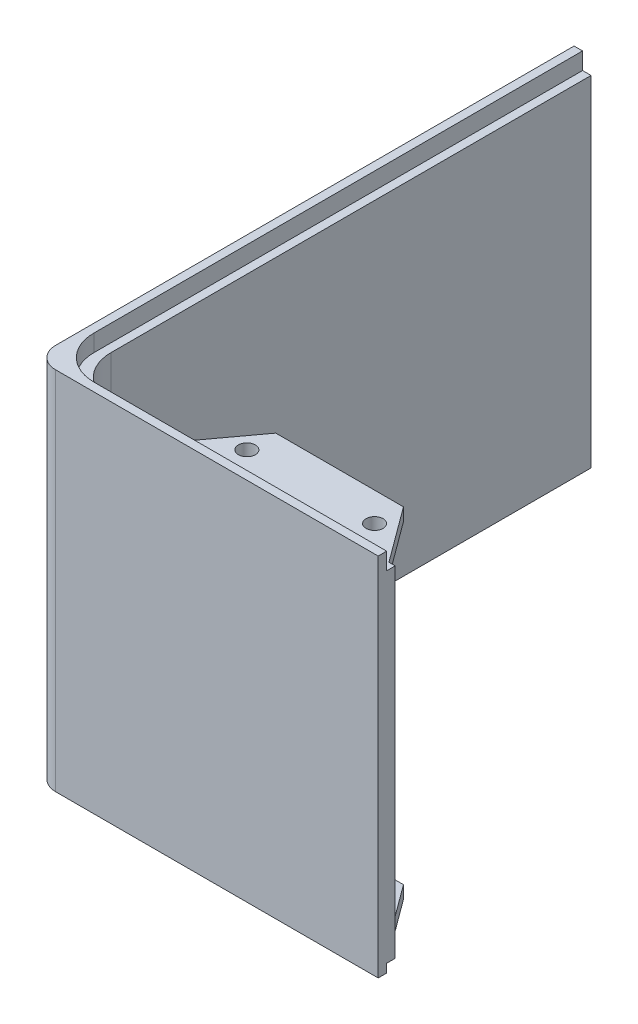
ISO-10303-21;
HEADER;
FILE_DESCRIPTION(('STEP AP214'),'2;1');
FILE_NAME('part.step','',(''),(''),'','','');
FILE_SCHEMA(('AUTOMOTIVE_DESIGN { 1 0 10303 214 1 1 1 1 }'));
ENDSEC;
DATA;
#1=APPLICATION_CONTEXT('core data for automotive mechanical design processes');
#2=APPLICATION_PROTOCOL_DEFINITION('international standard','automotive_design',2000,#1);
#3=PRODUCT_CONTEXT('',#1,'mechanical');
#4=PRODUCT('Part','Part','',(#3));
#5=PRODUCT_RELATED_PRODUCT_CATEGORY('part','',(#4));
#6=PRODUCT_DEFINITION_FORMATION('','',#4);
#7=PRODUCT_DEFINITION_CONTEXT('part definition',#1,'design');
#8=PRODUCT_DEFINITION('design','',#6,#7);
#9=PRODUCT_DEFINITION_SHAPE('','',#8);
#10=(LENGTH_UNIT() NAMED_UNIT(*) SI_UNIT(.MILLI.,.METRE.));
#11=(NAMED_UNIT(*) PLANE_ANGLE_UNIT() SI_UNIT($,.RADIAN.));
#12=(NAMED_UNIT(*) SI_UNIT($,.STERADIAN.) SOLID_ANGLE_UNIT());
#13=UNCERTAINTY_MEASURE_WITH_UNIT(LENGTH_MEASURE(1.E-05),#10,'distance_accuracy_value','');
#14=(GEOMETRIC_REPRESENTATION_CONTEXT(3) GLOBAL_UNCERTAINTY_ASSIGNED_CONTEXT((#13)) GLOBAL_UNIT_ASSIGNED_CONTEXT((#10,
#11,#12)) REPRESENTATION_CONTEXT('',''));
#15=CARTESIAN_POINT('',(0.,0.,0.));
#16=DIRECTION('',(0.,0.,1.));
#17=DIRECTION('',(1.,0.,0.));
#18=AXIS2_PLACEMENT_3D('',#15,#16,#17);
#19=CARTESIAN_POINT('',(0.,0.,123.));
#20=DIRECTION('',(0.,0.,1.));
#21=DIRECTION('',(1.,0.,0.));
#22=AXIS2_PLACEMENT_3D('',#19,#20,#21);
#23=PLANE('',#22);
#24=DIRECTION('',(0.,1.,0.));
#25=VECTOR('',#24,1.);
#26=CARTESIAN_POINT('',(78.4266666666667,36.,123.));
#27=LINE('',#26,#25);
#28=CARTESIAN_POINT('',(78.4266666666667,36.,123.));
#29=VERTEX_POINT('',#28);
#30=CARTESIAN_POINT('',(78.4266666666667,39.,123.));
#31=VERTEX_POINT('',#30);
#32=EDGE_CURVE('E253',#29,#31,#27,.T.);
#33=ORIENTED_EDGE('',*,*,#32,.T.);
#34=DIRECTION('',(1.,0.,0.));
#35=VECTOR('',#34,1.);
#36=CARTESIAN_POINT('',(-3.47213595499959,39.,123.));
#37=LINE('',#36,#35);
#38=CARTESIAN_POINT('',(79.9,39.,123.));
#39=VERTEX_POINT('',#38);
#40=EDGE_CURVE('E326',#31,#39,#37,.T.);
#41=ORIENTED_EDGE('',*,*,#40,.T.);
#42=DIRECTION('',(0.,1.,0.));
#43=VECTOR('',#42,1.);
#44=CARTESIAN_POINT('',(79.9,-42.9999999999999,123.));
#45=LINE('',#44,#43);
#46=CARTESIAN_POINT('',(79.9,-41.,123.));
#47=VERTEX_POINT('',#46);
#48=EDGE_CURVE('E325',#47,#39,#45,.T.);
#49=ORIENTED_EDGE('',*,*,#48,.F.);
#50=DIRECTION('',(1.,0.,0.));
#51=VECTOR('',#50,1.);
#52=CARTESIAN_POINT('',(-3.47213595499959,-41.,123.));
#53=LINE('',#52,#51);
#54=CARTESIAN_POINT('',(78.4266666666667,-41.,123.));
#55=VERTEX_POINT('',#54);
#56=EDGE_CURVE('E301',#55,#47,#53,.T.);
#57=ORIENTED_EDGE('',*,*,#56,.F.);
#58=DIRECTION('',(0.,-1.,0.));
#59=VECTOR('',#58,1.);
#60=CARTESIAN_POINT('',(78.4266666666667,-38.,123.));
#61=LINE('',#60,#59);
#62=CARTESIAN_POINT('',(78.4266666666667,-38.,123.));
#63=VERTEX_POINT('',#62);
#64=EDGE_CURVE('E306',#63,#55,#61,.T.);
#65=ORIENTED_EDGE('',*,*,#64,.F.);
#66=DIRECTION('',(1.,0.,0.));
#67=VECTOR('',#66,1.);
#68=CARTESIAN_POINT('',(0.,-38.,123.));
#69=LINE('',#68,#67);
#70=CARTESIAN_POINT('',(29.2225760349674,-38.,123.));
#71=VERTEX_POINT('',#70);
#72=EDGE_CURVE('E283',#71,#63,#69,.T.);
#73=ORIENTED_EDGE('',*,*,#72,.F.);
#74=DIRECTION('',(0.,-1.,0.));
#75=VECTOR('',#74,1.);
#76=CARTESIAN_POINT('',(29.2225760349674,-38.,123.));
#77=LINE('',#76,#75);
#78=CARTESIAN_POINT('',(29.2225760349674,-41.,123.));
#79=VERTEX_POINT('',#78);
#80=EDGE_CURVE('E302',#71,#79,#77,.T.);
#81=ORIENTED_EDGE('',*,*,#80,.T.);
#82=CARTESIAN_POINT('',(13.,-41.,123.));
#83=VERTEX_POINT('',#82);
#84=EDGE_CURVE('E332',#83,#79,#53,.T.);
#85=ORIENTED_EDGE('',*,*,#84,.F.);
#86=DIRECTION('',(0.,1.,0.));
#87=VECTOR('',#86,1.);
#88=CARTESIAN_POINT('',(13.,39.,123.));
#89=LINE('',#88,#87);
#90=CARTESIAN_POINT('',(13.,39.,123.));
#91=VERTEX_POINT('',#90);
#92=EDGE_CURVE('E446',#83,#91,#89,.T.);
#93=ORIENTED_EDGE('',*,*,#92,.T.);
#94=CARTESIAN_POINT('',(29.2225760349674,39.,123.));
#95=VERTEX_POINT('',#94);
#96=EDGE_CURVE('E322',#91,#95,#37,.T.);
#97=ORIENTED_EDGE('',*,*,#96,.T.);
#98=DIRECTION('',(0.,1.,0.));
#99=VECTOR('',#98,1.);
#100=CARTESIAN_POINT('',(29.2225760349674,36.,123.));
#101=LINE('',#100,#99);
#102=CARTESIAN_POINT('',(29.2225760349674,36.,123.));
#103=VERTEX_POINT('',#102);
#104=EDGE_CURVE('E65',#103,#95,#101,.T.);
#105=ORIENTED_EDGE('',*,*,#104,.F.);
#106=DIRECTION('',(1.,0.,0.));
#107=VECTOR('',#106,1.);
#108=CARTESIAN_POINT('',(0.,36.,123.));
#109=LINE('',#108,#107);
#110=EDGE_CURVE('E69',#103,#29,#109,.T.);
#111=ORIENTED_EDGE('',*,*,#110,.T.);
#112=EDGE_LOOP('',(#33,#41,#49,#57,#65,#73,#81,#85,#93,#97,#105,#111));
#113=FACE_BOUND('',#112,.T.);
#114=ADVANCED_FACE('F49',(#113),#23,.F.);
#115=CARTESIAN_POINT('',(-0.999999999999999,43.,123.));
#116=DIRECTION('',(0.,-1.,0.));
#117=DIRECTION('',(0.,0.,-1.));
#118=AXIS2_PLACEMENT_3D('',#115,#116,#117);
#119=PLANE('',#118);
#120=DIRECTION('',(0.,0.,-1.));
#121=VECTOR('',#120,1.);
#122=CARTESIAN_POINT('',(-0.999999999999999,43.,123.));
#123=LINE('',#122,#121);
#124=CARTESIAN_POINT('',(-0.999999999999999,43.,122.));
#125=VERTEX_POINT('',#124);
#126=CARTESIAN_POINT('',(-0.999999999999999,43.,0.));
#127=VERTEX_POINT('',#126);
#128=EDGE_CURVE('E423',#125,#127,#123,.T.);
#129=ORIENTED_EDGE('',*,*,#128,.F.);
#130=CARTESIAN_POINT('',(4.,43.,122.));
#131=DIRECTION('',(0.,-1.,0.));
#132=DIRECTION('',(0.,0.,-1.));
#133=AXIS2_PLACEMENT_3D('',#130,#131,#132);
#134=CIRCLE('',#133,5.);
#135=CARTESIAN_POINT('',(4.,43.,127.));
#136=VERTEX_POINT('',#135);
#137=EDGE_CURVE('E436',#125,#136,#134,.F.);
#138=ORIENTED_EDGE('',*,*,#137,.T.);
#139=DIRECTION('',(-1.,0.,0.));
#140=VECTOR('',#139,1.);
#141=CARTESIAN_POINT('',(79.9,43.,127.));
#142=LINE('',#141,#140);
#143=CARTESIAN_POINT('',(79.9,43.,127.));
#144=VERTEX_POINT('',#143);
#145=EDGE_CURVE('E355',#144,#136,#142,.T.);
#146=ORIENTED_EDGE('',*,*,#145,.F.);
#147=DIRECTION('',(0.,0.,-1.));
#148=VECTOR('',#147,1.);
#149=CARTESIAN_POINT('',(79.9,43.,127.));
#150=LINE('',#149,#148);
#151=CARTESIAN_POINT('',(79.9,43.,125.));
#152=VERTEX_POINT('',#151);
#153=EDGE_CURVE('E359',#144,#152,#150,.T.);
#154=ORIENTED_EDGE('',*,*,#153,.T.);
#155=DIRECTION('',(1.,0.,0.));
#156=VECTOR('',#155,1.);
#157=CARTESIAN_POINT('',(-3.47213595499959,43.,125.));
#158=LINE('',#157,#156);
#159=CARTESIAN_POINT('',(11.,43.,125.));
#160=VERTEX_POINT('',#159);
#161=EDGE_CURVE('E316',#160,#152,#158,.T.);
#162=ORIENTED_EDGE('',*,*,#161,.F.);
#163=CARTESIAN_POINT('',(11.,43.,115.));
#164=DIRECTION('',(0.,-1.,0.));
#165=DIRECTION('',(0.,0.,-1.));
#166=AXIS2_PLACEMENT_3D('',#163,#164,#165);
#167=CIRCLE('',#166,10.);
#168=CARTESIAN_POINT('',(1.,43.,115.));
#169=VERTEX_POINT('',#168);
#170=EDGE_CURVE('E469',#160,#169,#167,.T.);
#171=ORIENTED_EDGE('',*,*,#170,.T.);
#172=DIRECTION('',(0.,0.,-1.));
#173=VECTOR('',#172,1.);
#174=CARTESIAN_POINT('',(1.,43.,123.));
#175=LINE('',#174,#173);
#176=CARTESIAN_POINT('',(1.,43.,0.));
#177=VERTEX_POINT('',#176);
#178=EDGE_CURVE('E402',#169,#177,#175,.T.);
#179=ORIENTED_EDGE('',*,*,#178,.T.);
#180=DIRECTION('',(-1.,0.,0.));
#181=VECTOR('',#180,1.);
#182=CARTESIAN_POINT('',(-0.999999999999999,43.,0.));
#183=LINE('',#182,#181);
#184=EDGE_CURVE('E370',#177,#127,#183,.T.);
#185=ORIENTED_EDGE('',*,*,#184,.T.);
#186=EDGE_LOOP('',(#129,#138,#146,#154,#162,#171,#179,#185));
#187=FACE_BOUND('',#186,.T.);
#188=ADVANCED_FACE('F514',(#187),#119,.F.);
#189=CARTESIAN_POINT('',(-0.999999999999999,-43.,123.));
#190=DIRECTION('',(1.,0.,0.));
#191=DIRECTION('',(0.,0.,-1.));
#192=AXIS2_PLACEMENT_3D('',#189,#190,#191);
#193=PLANE('',#192);
#194=DIRECTION('',(0.,0.,-1.));
#195=VECTOR('',#194,1.);
#196=CARTESIAN_POINT('',(-0.999999999999999,-43.,123.));
#197=LINE('',#196,#195);
#198=CARTESIAN_POINT('',(-0.999999999999999,-43.,122.));
#199=VERTEX_POINT('',#198);
#200=CARTESIAN_POINT('',(-0.999999999999999,-43.,0.));
#201=VERTEX_POINT('',#200);
#202=EDGE_CURVE('E420',#199,#201,#197,.T.);
#203=ORIENTED_EDGE('',*,*,#202,.F.);
#204=DIRECTION('',(0.,-1.,0.));
#205=VECTOR('',#204,1.);
#206=CARTESIAN_POINT('',(-0.999999999999999,43.,122.));
#207=LINE('',#206,#205);
#208=EDGE_CURVE('E433',#199,#125,#207,.F.);
#209=ORIENTED_EDGE('',*,*,#208,.T.);
#210=ORIENTED_EDGE('',*,*,#128,.T.);
#211=DIRECTION('',(0.,-1.,0.));
#212=VECTOR('',#211,1.);
#213=CARTESIAN_POINT('',(-0.999999999999999,-43.,0.));
#214=LINE('',#213,#212);
#215=EDGE_CURVE('E374',#127,#201,#214,.T.);
#216=ORIENTED_EDGE('',*,*,#215,.T.);
#217=EDGE_LOOP('',(#203,#209,#210,#216));
#218=FACE_BOUND('',#217,.T.);
#219=ADVANCED_FACE('F511',(#218),#193,.F.);
#220=CARTESIAN_POINT('',(-0.999999999999999,-43.,123.));
#221=DIRECTION('',(0.,1.,0.));
#222=DIRECTION('',(0.,0.,1.));
#223=AXIS2_PLACEMENT_3D('',#220,#221,#222);
#224=PLANE('',#223);
#225=DIRECTION('',(1.,0.,0.));
#226=VECTOR('',#225,1.);
#227=CARTESIAN_POINT('',(79.9,-42.9999999999999,127.));
#228=LINE('',#227,#226);
#229=CARTESIAN_POINT('',(4.,-43.,127.));
#230=VERTEX_POINT('',#229);
#231=CARTESIAN_POINT('',(79.9,-42.9999999999999,127.));
#232=VERTEX_POINT('',#231);
#233=EDGE_CURVE('E349',#230,#232,#228,.T.);
#234=ORIENTED_EDGE('',*,*,#233,.F.);
#235=CARTESIAN_POINT('',(4.,-43.,122.));
#236=DIRECTION('',(0.,1.,0.));
#237=DIRECTION('',(0.,0.,1.));
#238=AXIS2_PLACEMENT_3D('',#235,#236,#237);
#239=CIRCLE('',#238,5.);
#240=EDGE_CURVE('E430',#230,#199,#239,.F.);
#241=ORIENTED_EDGE('',*,*,#240,.T.);
#242=ORIENTED_EDGE('',*,*,#202,.T.);
#243=DIRECTION('',(1.,0.,0.));
#244=VECTOR('',#243,1.);
#245=CARTESIAN_POINT('',(-0.999999999999999,-43.,0.));
#246=LINE('',#245,#244);
#247=CARTESIAN_POINT('',(1.,-43.,0.));
#248=VERTEX_POINT('',#247);
#249=EDGE_CURVE('E378',#201,#248,#246,.T.);
#250=ORIENTED_EDGE('',*,*,#249,.T.);
#251=DIRECTION('',(0.,0.,-1.));
#252=VECTOR('',#251,1.);
#253=CARTESIAN_POINT('',(1.,-43.,123.));
#254=LINE('',#253,#252);
#255=CARTESIAN_POINT('',(1.,-43.,115.));
#256=VERTEX_POINT('',#255);
#257=EDGE_CURVE('E417',#256,#248,#254,.T.);
#258=ORIENTED_EDGE('',*,*,#257,.F.);
#259=CARTESIAN_POINT('',(11.,-43.,115.));
#260=DIRECTION('',(0.,1.,0.));
#261=DIRECTION('',(0.,0.,1.));
#262=AXIS2_PLACEMENT_3D('',#259,#260,#261);
#263=CIRCLE('',#262,10.);
#264=CARTESIAN_POINT('',(11.,-43.,125.));
#265=VERTEX_POINT('',#264);
#266=EDGE_CURVE('E460',#256,#265,#263,.T.);
#267=ORIENTED_EDGE('',*,*,#266,.T.);
#268=DIRECTION('',(1.,0.,0.));
#269=VECTOR('',#268,1.);
#270=CARTESIAN_POINT('',(-3.47213595499959,-43.,125.));
#271=LINE('',#270,#269);
#272=CARTESIAN_POINT('',(79.9,-43.,125.));
#273=VERTEX_POINT('',#272);
#274=EDGE_CURVE('E336',#265,#273,#271,.T.);
#275=ORIENTED_EDGE('',*,*,#274,.T.);
#276=DIRECTION('',(0.,0.,-1.));
#277=VECTOR('',#276,1.);
#278=CARTESIAN_POINT('',(79.9,-42.9999999999999,127.));
#279=LINE('',#278,#277);
#280=EDGE_CURVE('E366',#232,#273,#279,.T.);
#281=ORIENTED_EDGE('',*,*,#280,.F.);
#282=EDGE_LOOP('',(#234,#241,#242,#250,#258,#267,#275,#281));
#283=FACE_BOUND('',#282,.T.);
#284=ADVANCED_FACE('F489',(#283),#224,.F.);
#285=CARTESIAN_POINT('',(1.,-43.,123.));
#286=DIRECTION('',(-1.,0.,0.));
#287=DIRECTION('',(0.,-1.,0.));
#288=AXIS2_PLACEMENT_3D('',#285,#286,#287);
#289=PLANE('',#288);
#290=DIRECTION('',(0.,0.,-1.));
#291=VECTOR('',#290,1.);
#292=CARTESIAN_POINT('',(1.,-41.,123.));
#293=LINE('',#292,#291);
#294=CARTESIAN_POINT('',(1.,-41.,115.));
#295=VERTEX_POINT('',#294);
#296=CARTESIAN_POINT('',(1.,-41.,0.));
#297=VERTEX_POINT('',#296);
#298=EDGE_CURVE('E414',#295,#297,#293,.T.);
#299=ORIENTED_EDGE('',*,*,#298,.F.);
#300=DIRECTION('',(0.,-1.,0.));
#301=VECTOR('',#300,1.);
#302=CARTESIAN_POINT('',(1.,-43.,115.));
#303=LINE('',#302,#301);
#304=EDGE_CURVE('E439',#295,#256,#303,.T.);
#305=ORIENTED_EDGE('',*,*,#304,.T.);
#306=ORIENTED_EDGE('',*,*,#257,.T.);
#307=DIRECTION('',(0.,1.,0.));
#308=VECTOR('',#307,1.);
#309=CARTESIAN_POINT('',(1.,-43.,0.));
#310=LINE('',#309,#308);
#311=EDGE_CURVE('E382',#248,#297,#310,.T.);
#312=ORIENTED_EDGE('',*,*,#311,.T.);
#313=EDGE_LOOP('',(#299,#305,#306,#312));
#314=FACE_BOUND('',#313,.T.);
#315=ADVANCED_FACE('F481',(#314),#289,.F.);
#316=CARTESIAN_POINT('',(3.,-41.,123.));
#317=DIRECTION('',(0.,1.,0.));
#318=DIRECTION('',(0.,0.,1.));
#319=AXIS2_PLACEMENT_3D('',#316,#317,#318);
#320=PLANE('',#319);
#321=CARTESIAN_POINT('',(38.8,-41.,116.8));
#322=DIRECTION('',(0.,1.,0.));
#323=DIRECTION('',(0.,0.,1.));
#324=AXIS2_PLACEMENT_3D('',#321,#322,#323);
#325=CIRCLE('',#324,2.);
#326=CARTESIAN_POINT('',(38.8,-41.,118.8));
#327=VERTEX_POINT('',#326);
#328=EDGE_CURVE('E258',#327,#327,#325,.T.);
#329=ORIENTED_EDGE('',*,*,#328,.T.);
#330=EDGE_LOOP('',(#329));
#331=FACE_BOUND('',#330,.T.);
#332=CARTESIAN_POINT('',(68.85,-41.,116.8));
#333=DIRECTION('',(0.,1.,0.));
#334=DIRECTION('',(0.,0.,1.));
#335=AXIS2_PLACEMENT_3D('',#332,#333,#334);
#336=CIRCLE('',#335,2.);
#337=CARTESIAN_POINT('',(68.85,-41.,118.8));
#338=VERTEX_POINT('',#337);
#339=EDGE_CURVE('E252',#338,#338,#336,.T.);
#340=ORIENTED_EDGE('',*,*,#339,.T.);
#341=EDGE_LOOP('',(#340));
#342=FACE_BOUND('',#341,.T.);
#343=DIRECTION('',(1.,0.,0.));
#344=VECTOR('',#343,1.);
#345=CARTESIAN_POINT('',(-3.47213595499959,-41.,125.));
#346=LINE('',#345,#344);
#347=CARTESIAN_POINT('',(11.,-41.,125.));
#348=VERTEX_POINT('',#347);
#349=CARTESIAN_POINT('',(79.9,-41.,125.));
#350=VERTEX_POINT('',#349);
#351=EDGE_CURVE('E337',#348,#350,#346,.T.);
#352=ORIENTED_EDGE('',*,*,#351,.F.);
#353=CARTESIAN_POINT('',(11.,-41.,115.));
#354=DIRECTION('',(0.,1.,0.));
#355=DIRECTION('',(0.,0.,1.));
#356=AXIS2_PLACEMENT_3D('',#353,#354,#355);
#357=CIRCLE('',#356,10.);
#358=EDGE_CURVE('E58',#348,#295,#357,.F.);
#359=ORIENTED_EDGE('',*,*,#358,.T.);
#360=ORIENTED_EDGE('',*,*,#298,.T.);
#361=DIRECTION('',(1.,0.,0.));
#362=VECTOR('',#361,1.);
#363=CARTESIAN_POINT('',(3.,-41.,0.));
#364=LINE('',#363,#362);
#365=CARTESIAN_POINT('',(3.,-41.,0.));
#366=VERTEX_POINT('',#365);
#367=EDGE_CURVE('E386',#297,#366,#364,.T.);
#368=ORIENTED_EDGE('',*,*,#367,.T.);
#369=DIRECTION('',(0.,0.,-1.));
#370=VECTOR('',#369,1.);
#371=CARTESIAN_POINT('',(3.,-41.,123.));
#372=LINE('',#371,#370);
#373=CARTESIAN_POINT('',(3.,-41.,113.));
#374=VERTEX_POINT('',#373);
#375=EDGE_CURVE('E411',#374,#366,#372,.T.);
#376=ORIENTED_EDGE('',*,*,#375,.F.);
#377=CARTESIAN_POINT('',(13.,-41.,113.));
#378=DIRECTION('',(0.,1.,0.));
#379=DIRECTION('',(0.,0.,1.));
#380=AXIS2_PLACEMENT_3D('',#377,#378,#379);
#381=CIRCLE('',#380,10.);
#382=EDGE_CURVE('E466',#374,#83,#381,.T.);
#383=ORIENTED_EDGE('',*,*,#382,.T.);
#384=ORIENTED_EDGE('',*,*,#84,.T.);
#385=DIRECTION('',(-0.593137889518411,0.,0.805100890583066));
#386=VECTOR('',#385,1.);
#387=CARTESIAN_POINT('',(77.6786155677662,-41.,57.2277718699445));
#388=LINE('',#387,#386);
#389=CARTESIAN_POINT('',(38.8,-41.,110.));
#390=VERTEX_POINT('',#389);
#391=EDGE_CURVE('E279',#390,#79,#388,.T.);
#392=ORIENTED_EDGE('',*,*,#391,.F.);
#393=DIRECTION('',(1.,0.,0.));
#394=VECTOR('',#393,1.);
#395=CARTESIAN_POINT('',(0.,-41.,110.));
#396=LINE('',#395,#394);
#397=CARTESIAN_POINT('',(68.85,-41.,110.));
#398=VERTEX_POINT('',#397);
#399=EDGE_CURVE('E262',#390,#398,#396,.T.);
#400=ORIENTED_EDGE('',*,*,#399,.T.);
#401=DIRECTION('',(0.593107488179526,0.,0.805123287121528));
#402=VECTOR('',#401,1.);
#403=CARTESIAN_POINT('',(-7.89752306595316,-41.,5.81784199191883));
#404=LINE('',#403,#402);
#405=EDGE_CURVE('E293',#398,#55,#404,.T.);
#406=ORIENTED_EDGE('',*,*,#405,.T.);
#407=ORIENTED_EDGE('',*,*,#56,.T.);
#408=DIRECTION('',(0.,0.,1.));
#409=VECTOR('',#408,1.);
#410=CARTESIAN_POINT('',(79.9,-41.,125.));
#411=LINE('',#410,#409);
#412=EDGE_CURVE('E321',#47,#350,#411,.T.);
#413=ORIENTED_EDGE('',*,*,#412,.T.);
#414=EDGE_LOOP('',(#352,#359,#360,#368,#376,#383,#384,#392,#400,#406,#407,#413));
#415=FACE_BOUND('',#414,.T.);
#416=ADVANCED_FACE('F476',(#331,#342,#415),#320,.F.);
#417=CARTESIAN_POINT('',(3.,-41.,123.));
#418=DIRECTION('',(-1.,0.,0.));
#419=DIRECTION('',(0.,-1.,0.));
#420=AXIS2_PLACEMENT_3D('',#417,#418,#419);
#421=PLANE('',#420);
#422=DIRECTION('',(0.,0.,-1.));
#423=VECTOR('',#422,1.);
#424=CARTESIAN_POINT('',(3.,39.,123.));
#425=LINE('',#424,#423);
#426=CARTESIAN_POINT('',(3.,39.,113.));
#427=VERTEX_POINT('',#426);
#428=CARTESIAN_POINT('',(3.,39.,0.));
#429=VERTEX_POINT('',#428);
#430=EDGE_CURVE('E408',#427,#429,#425,.T.);
#431=ORIENTED_EDGE('',*,*,#430,.F.);
#432=DIRECTION('',(0.,1.,0.));
#433=VECTOR('',#432,1.);
#434=CARTESIAN_POINT('',(3.,-41.,113.));
#435=LINE('',#434,#433);
#436=EDGE_CURVE('E450',#427,#374,#435,.F.);
#437=ORIENTED_EDGE('',*,*,#436,.T.);
#438=ORIENTED_EDGE('',*,*,#375,.T.);
#439=DIRECTION('',(0.,1.,0.));
#440=VECTOR('',#439,1.);
#441=CARTESIAN_POINT('',(3.,-41.,0.));
#442=LINE('',#441,#440);
#443=EDGE_CURVE('E390',#366,#429,#442,.T.);
#444=ORIENTED_EDGE('',*,*,#443,.T.);
#445=EDGE_LOOP('',(#431,#437,#438,#444));
#446=FACE_BOUND('',#445,.T.);
#447=ADVANCED_FACE('F591',(#446),#421,.F.);
#448=CARTESIAN_POINT('',(3.,39.,123.));
#449=DIRECTION('',(0.,-1.,0.));
#450=DIRECTION('',(0.,0.,-1.));
#451=AXIS2_PLACEMENT_3D('',#448,#449,#450);
#452=PLANE('',#451);
#453=CARTESIAN_POINT('',(38.8,39.,116.8));
#454=DIRECTION('',(0.,1.,0.));
#455=DIRECTION('',(0.,0.,1.));
#456=AXIS2_PLACEMENT_3D('',#453,#454,#455);
#457=CIRCLE('',#456,2.);
#458=CARTESIAN_POINT('',(38.8,39.,118.8));
#459=VERTEX_POINT('',#458);
#460=EDGE_CURVE('E244',#459,#459,#457,.T.);
#461=ORIENTED_EDGE('',*,*,#460,.F.);
#462=EDGE_LOOP('',(#461));
#463=FACE_BOUND('',#462,.T.);
#464=CARTESIAN_POINT('',(68.85,39.,116.8));
#465=DIRECTION('',(0.,1.,0.));
#466=DIRECTION('',(0.,0.,1.));
#467=AXIS2_PLACEMENT_3D('',#464,#465,#466);
#468=CIRCLE('',#467,2.);
#469=CARTESIAN_POINT('',(68.85,39.,118.8));
#470=VERTEX_POINT('',#469);
#471=EDGE_CURVE('E820',#470,#470,#468,.T.);
#472=ORIENTED_EDGE('',*,*,#471,.F.);
#473=EDGE_LOOP('',(#472));
#474=FACE_BOUND('',#473,.T.);
#475=DIRECTION('',(0.,0.,-1.));
#476=VECTOR('',#475,1.);
#477=CARTESIAN_POINT('',(1.,39.,123.));
#478=LINE('',#477,#476);
#479=CARTESIAN_POINT('',(1.,39.,115.));
#480=VERTEX_POINT('',#479);
#481=CARTESIAN_POINT('',(1.,39.,0.));
#482=VERTEX_POINT('',#481);
#483=EDGE_CURVE('E405',#480,#482,#478,.T.);
#484=ORIENTED_EDGE('',*,*,#483,.F.);
#485=CARTESIAN_POINT('',(11.,39.,115.));
#486=DIRECTION('',(0.,-1.,0.));
#487=DIRECTION('',(0.,0.,-1.));
#488=AXIS2_PLACEMENT_3D('',#485,#486,#487);
#489=CIRCLE('',#488,10.);
#490=CARTESIAN_POINT('',(11.,39.,125.));
#491=VERTEX_POINT('',#490);
#492=EDGE_CURVE('E11',#480,#491,#489,.F.);
#493=ORIENTED_EDGE('',*,*,#492,.T.);
#494=DIRECTION('',(1.,0.,0.));
#495=VECTOR('',#494,1.);
#496=CARTESIAN_POINT('',(-3.47213595499959,39.,125.));
#497=LINE('',#496,#495);
#498=CARTESIAN_POINT('',(79.9,39.,125.));
#499=VERTEX_POINT('',#498);
#500=EDGE_CURVE('E327',#491,#499,#497,.T.);
#501=ORIENTED_EDGE('',*,*,#500,.T.);
#502=DIRECTION('',(0.,0.,-1.));
#503=VECTOR('',#502,1.);
#504=CARTESIAN_POINT('',(79.9,39.,125.));
#505=LINE('',#504,#503);
#506=EDGE_CURVE('E312',#499,#39,#505,.T.);
#507=ORIENTED_EDGE('',*,*,#506,.T.);
#508=ORIENTED_EDGE('',*,*,#40,.F.);
#509=DIRECTION('',(0.593107488179526,0.,0.805123287121528));
#510=VECTOR('',#509,1.);
#511=CARTESIAN_POINT('',(-7.89752306595316,39.,5.81784199191883));
#512=LINE('',#511,#510);
#513=CARTESIAN_POINT('',(68.85,39.,110.));
#514=VERTEX_POINT('',#513);
#515=EDGE_CURVE('E230',#514,#31,#512,.T.);
#516=ORIENTED_EDGE('',*,*,#515,.F.);
#517=DIRECTION('',(1.,0.,0.));
#518=VECTOR('',#517,1.);
#519=CARTESIAN_POINT('',(0.,39.,110.));
#520=LINE('',#519,#518);
#521=CARTESIAN_POINT('',(38.8,39.,110.));
#522=VERTEX_POINT('',#521);
#523=EDGE_CURVE('E241',#522,#514,#520,.T.);
#524=ORIENTED_EDGE('',*,*,#523,.F.);
#525=DIRECTION('',(-0.593137889518411,0.,0.805100890583066));
#526=VECTOR('',#525,1.);
#527=CARTESIAN_POINT('',(77.6786155677662,39.,57.2277718699445));
#528=LINE('',#527,#526);
#529=EDGE_CURVE('E215',#522,#95,#528,.T.);
#530=ORIENTED_EDGE('',*,*,#529,.T.);
#531=ORIENTED_EDGE('',*,*,#96,.F.);
#532=CARTESIAN_POINT('',(13.,39.,113.));
#533=DIRECTION('',(0.,-1.,0.));
#534=DIRECTION('',(0.,0.,-1.));
#535=AXIS2_PLACEMENT_3D('',#532,#533,#534);
#536=CIRCLE('',#535,10.);
#537=EDGE_CURVE('E463',#91,#427,#536,.T.);
#538=ORIENTED_EDGE('',*,*,#537,.T.);
#539=ORIENTED_EDGE('',*,*,#430,.T.);
#540=DIRECTION('',(-1.,0.,0.));
#541=VECTOR('',#540,1.);
#542=CARTESIAN_POINT('',(3.,39.,0.));
#543=LINE('',#542,#541);
#544=EDGE_CURVE('E394',#429,#482,#543,.T.);
#545=ORIENTED_EDGE('',*,*,#544,.T.);
#546=EDGE_LOOP('',(#484,#493,#501,#507,#508,#516,#524,#530,#531,#538,#539,#545));
#547=FACE_BOUND('',#546,.T.);
#548=ADVANCED_FACE('F534',(#463,#474,#547),#452,.F.);
#549=CARTESIAN_POINT('',(1.,39.,123.));
#550=DIRECTION('',(-1.,0.,0.));
#551=DIRECTION('',(0.,-1.,0.));
#552=AXIS2_PLACEMENT_3D('',#549,#550,#551);
#553=PLANE('',#552);
#554=ORIENTED_EDGE('',*,*,#178,.F.);
#555=DIRECTION('',(0.,-1.,0.));
#556=VECTOR('',#555,1.);
#557=CARTESIAN_POINT('',(1.,39.,115.));
#558=LINE('',#557,#556);
#559=EDGE_CURVE('E453',#169,#480,#558,.T.);
#560=ORIENTED_EDGE('',*,*,#559,.T.);
#561=ORIENTED_EDGE('',*,*,#483,.T.);
#562=DIRECTION('',(0.,1.,0.));
#563=VECTOR('',#562,1.);
#564=CARTESIAN_POINT('',(1.,39.,0.));
#565=LINE('',#564,#563);
#566=EDGE_CURVE('E398',#482,#177,#565,.T.);
#567=ORIENTED_EDGE('',*,*,#566,.T.);
#568=EDGE_LOOP('',(#554,#560,#561,#567));
#569=FACE_BOUND('',#568,.T.);
#570=ADVANCED_FACE('F586',(#569),#553,.F.);
#571=CARTESIAN_POINT('',(0.,0.,0.));
#572=DIRECTION('',(0.,0.,1.));
#573=DIRECTION('',(1.,0.,0.));
#574=AXIS2_PLACEMENT_3D('',#571,#572,#573);
#575=PLANE('',#574);
#576=ORIENTED_EDGE('',*,*,#184,.F.);
#577=ORIENTED_EDGE('',*,*,#566,.F.);
#578=ORIENTED_EDGE('',*,*,#544,.F.);
#579=ORIENTED_EDGE('',*,*,#443,.F.);
#580=ORIENTED_EDGE('',*,*,#367,.F.);
#581=ORIENTED_EDGE('',*,*,#311,.F.);
#582=ORIENTED_EDGE('',*,*,#249,.F.);
#583=ORIENTED_EDGE('',*,*,#215,.F.);
#584=EDGE_LOOP('',(#576,#577,#578,#579,#580,#581,#582,#583));
#585=FACE_BOUND('',#584,.T.);
#586=ADVANCED_FACE('F519',(#585),#575,.F.);
#587=CARTESIAN_POINT('',(79.9,-42.9999999999999,127.));
#588=DIRECTION('',(-1.,0.,0.));
#589=DIRECTION('',(0.,0.,1.));
#590=AXIS2_PLACEMENT_3D('',#587,#588,#589);
#591=PLANE('',#590);
#592=ORIENTED_EDGE('',*,*,#506,.F.);
#593=DIRECTION('',(0.,-1.,0.));
#594=VECTOR('',#593,1.);
#595=CARTESIAN_POINT('',(79.9,39.,125.));
#596=LINE('',#595,#594);
#597=EDGE_CURVE('E317',#152,#499,#596,.T.);
#598=ORIENTED_EDGE('',*,*,#597,.F.);
#599=ORIENTED_EDGE('',*,*,#153,.F.);
#600=DIRECTION('',(0.,1.,0.));
#601=VECTOR('',#600,1.);
#602=CARTESIAN_POINT('',(79.9,-42.9999999999999,127.));
#603=LINE('',#602,#601);
#604=EDGE_CURVE('E352',#232,#144,#603,.T.);
#605=ORIENTED_EDGE('',*,*,#604,.F.);
#606=ORIENTED_EDGE('',*,*,#280,.T.);
#607=DIRECTION('',(0.,-1.,0.));
#608=VECTOR('',#607,1.);
#609=CARTESIAN_POINT('',(79.9,-43.,125.));
#610=LINE('',#609,#608);
#611=EDGE_CURVE('E340',#350,#273,#610,.T.);
#612=ORIENTED_EDGE('',*,*,#611,.F.);
#613=ORIENTED_EDGE('',*,*,#412,.F.);
#614=ORIENTED_EDGE('',*,*,#48,.T.);
#615=EDGE_LOOP('',(#592,#598,#599,#605,#606,#612,#613,#614));
#616=FACE_BOUND('',#615,.T.);
#617=ADVANCED_FACE('F498',(#616),#591,.F.);
#618=CARTESIAN_POINT('',(0.,0.,127.));
#619=DIRECTION('',(0.,0.,1.));
#620=DIRECTION('',(1.,0.,0.));
#621=AXIS2_PLACEMENT_3D('',#618,#619,#620);
#622=PLANE('',#621);
#623=ORIENTED_EDGE('',*,*,#145,.T.);
#624=DIRECTION('',(0.,-1.,0.));
#625=VECTOR('',#624,1.);
#626=CARTESIAN_POINT('',(4.,-43.,127.));
#627=LINE('',#626,#625);
#628=EDGE_CURVE('E426',#136,#230,#627,.T.);
#629=ORIENTED_EDGE('',*,*,#628,.T.);
#630=ORIENTED_EDGE('',*,*,#233,.T.);
#631=ORIENTED_EDGE('',*,*,#604,.T.);
#632=EDGE_LOOP('',(#623,#629,#630,#631));
#633=FACE_BOUND('',#632,.T.);
#634=ADVANCED_FACE('F502',(#633),#622,.T.);
#635=CARTESIAN_POINT('',(-3.47213595499959,-43.,125.));
#636=DIRECTION('',(0.,0.,1.));
#637=DIRECTION('',(1.,0.,0.));
#638=AXIS2_PLACEMENT_3D('',#635,#636,#637);
#639=PLANE('',#638);
#640=ORIENTED_EDGE('',*,*,#274,.F.);
#641=DIRECTION('',(0.,-1.,0.));
#642=VECTOR('',#641,1.);
#643=CARTESIAN_POINT('',(11.,-41.,125.));
#644=LINE('',#643,#642);
#645=EDGE_CURVE('E443',#265,#348,#644,.F.);
#646=ORIENTED_EDGE('',*,*,#645,.T.);
#647=ORIENTED_EDGE('',*,*,#351,.T.);
#648=ORIENTED_EDGE('',*,*,#611,.T.);
#649=EDGE_LOOP('',(#640,#646,#647,#648));
#650=FACE_BOUND('',#649,.T.);
#651=ADVANCED_FACE('F492',(#650),#639,.F.);
#652=CARTESIAN_POINT('',(-3.47213595499959,39.,125.));
#653=DIRECTION('',(0.,0.,1.));
#654=DIRECTION('',(1.,0.,0.));
#655=AXIS2_PLACEMENT_3D('',#652,#653,#654);
#656=PLANE('',#655);
#657=ORIENTED_EDGE('',*,*,#500,.F.);
#658=DIRECTION('',(0.,-1.,0.));
#659=VECTOR('',#658,1.);
#660=CARTESIAN_POINT('',(11.,43.,125.));
#661=LINE('',#660,#659);
#662=EDGE_CURVE('E457',#491,#160,#661,.F.);
#663=ORIENTED_EDGE('',*,*,#662,.T.);
#664=ORIENTED_EDGE('',*,*,#161,.T.);
#665=ORIENTED_EDGE('',*,*,#597,.T.);
#666=EDGE_LOOP('',(#657,#663,#664,#665));
#667=FACE_BOUND('',#666,.T.);
#668=ADVANCED_FACE('F606',(#667),#656,.F.);
#669=CARTESIAN_POINT('',(4.,0.,122.));
#670=DIRECTION('',(0.,1.,0.));
#671=DIRECTION('',(0.,0.,1.));
#672=AXIS2_PLACEMENT_3D('',#669,#670,#671);
#673=CYLINDRICAL_SURFACE('',#672,5.);
#674=ORIENTED_EDGE('',*,*,#137,.F.);
#675=ORIENTED_EDGE('',*,*,#208,.F.);
#676=ORIENTED_EDGE('',*,*,#240,.F.);
#677=ORIENTED_EDGE('',*,*,#628,.F.);
#678=EDGE_LOOP('',(#674,#675,#676,#677));
#679=FACE_BOUND('',#678,.T.);
#680=ADVANCED_FACE('F507',(#679),#673,.T.);
#681=CARTESIAN_POINT('',(11.,-43.,115.));
#682=DIRECTION('',(0.,1.,0.));
#683=DIRECTION('',(-1.,0.,0.));
#684=AXIS2_PLACEMENT_3D('',#681,#682,#683);
#685=CYLINDRICAL_SURFACE('',#684,10.);
#686=ORIENTED_EDGE('',*,*,#358,.F.);
#687=ORIENTED_EDGE('',*,*,#645,.F.);
#688=ORIENTED_EDGE('',*,*,#266,.F.);
#689=ORIENTED_EDGE('',*,*,#304,.F.);
#690=EDGE_LOOP('',(#686,#687,#688,#689));
#691=FACE_BOUND('',#690,.T.);
#692=ADVANCED_FACE('F485',(#691),#685,.F.);
#693=CARTESIAN_POINT('',(13.,0.,113.));
#694=DIRECTION('',(0.,-1.,0.));
#695=DIRECTION('',(1.,0.,0.));
#696=AXIS2_PLACEMENT_3D('',#693,#694,#695);
#697=CYLINDRICAL_SURFACE('',#696,10.);
#698=ORIENTED_EDGE('',*,*,#382,.F.);
#699=ORIENTED_EDGE('',*,*,#436,.F.);
#700=ORIENTED_EDGE('',*,*,#537,.F.);
#701=ORIENTED_EDGE('',*,*,#92,.F.);
#702=EDGE_LOOP('',(#698,#699,#700,#701));
#703=FACE_BOUND('',#702,.T.);
#704=ADVANCED_FACE('F530',(#703),#697,.F.);
#705=CARTESIAN_POINT('',(11.,39.,115.));
#706=DIRECTION('',(0.,1.,0.));
#707=DIRECTION('',(-1.,0.,0.));
#708=AXIS2_PLACEMENT_3D('',#705,#706,#707);
#709=CYLINDRICAL_SURFACE('',#708,10.);
#710=ORIENTED_EDGE('',*,*,#170,.F.);
#711=ORIENTED_EDGE('',*,*,#662,.F.);
#712=ORIENTED_EDGE('',*,*,#492,.F.);
#713=ORIENTED_EDGE('',*,*,#559,.F.);
#714=EDGE_LOOP('',(#710,#711,#712,#713));
#715=FACE_BOUND('',#714,.T.);
#716=ADVANCED_FACE('F51',(#715),#709,.F.);
#717=CARTESIAN_POINT('',(0.,-38.,110.));
#718=DIRECTION('',(0.,0.,-1.));
#719=DIRECTION('',(-1.,0.,0.));
#720=AXIS2_PLACEMENT_3D('',#717,#718,#719);
#721=PLANE('',#720);
#722=ORIENTED_EDGE('',*,*,#399,.F.);
#723=DIRECTION('',(0.,-1.,0.));
#724=VECTOR('',#723,1.);
#725=CARTESIAN_POINT('',(38.8,-38.,110.));
#726=LINE('',#725,#724);
#727=CARTESIAN_POINT('',(38.8,-38.,110.));
#728=VERTEX_POINT('',#727);
#729=EDGE_CURVE('E298',#728,#390,#726,.T.);
#730=ORIENTED_EDGE('',*,*,#729,.F.);
#731=DIRECTION('',(1.,0.,0.));
#732=VECTOR('',#731,1.);
#733=CARTESIAN_POINT('',(0.,-38.,110.));
#734=LINE('',#733,#732);
#735=CARTESIAN_POINT('',(68.85,-38.,110.));
#736=VERTEX_POINT('',#735);
#737=EDGE_CURVE('E274',#728,#736,#734,.T.);
#738=ORIENTED_EDGE('',*,*,#737,.T.);
#739=DIRECTION('',(0.,-1.,0.));
#740=VECTOR('',#739,1.);
#741=CARTESIAN_POINT('',(68.85,-38.,110.));
#742=LINE('',#741,#740);
#743=EDGE_CURVE('E289',#736,#398,#742,.T.);
#744=ORIENTED_EDGE('',*,*,#743,.T.);
#745=EDGE_LOOP('',(#722,#730,#738,#744));
#746=FACE_BOUND('',#745,.T.);
#747=ADVANCED_FACE('F556',(#746),#721,.T.);
#748=CARTESIAN_POINT('',(77.6786155677662,-38.,57.2277718699445));
#749=DIRECTION('',(0.805100890583066,0.,0.593137889518411));
#750=DIRECTION('',(0.593137889518411,0.,-0.805100890583066));
#751=AXIS2_PLACEMENT_3D('',#748,#749,#750);
#752=PLANE('',#751);
#753=ORIENTED_EDGE('',*,*,#391,.T.);
#754=ORIENTED_EDGE('',*,*,#80,.F.);
#755=DIRECTION('',(-0.593137889518411,0.,0.805100890583066));
#756=VECTOR('',#755,1.);
#757=CARTESIAN_POINT('',(77.6786155677662,-38.,57.2277718699445));
#758=LINE('',#757,#756);
#759=EDGE_CURVE('E286',#728,#71,#758,.T.);
#760=ORIENTED_EDGE('',*,*,#759,.F.);
#761=ORIENTED_EDGE('',*,*,#729,.T.);
#762=EDGE_LOOP('',(#753,#754,#760,#761));
#763=FACE_BOUND('',#762,.T.);
#764=ADVANCED_FACE('F561',(#763),#752,.F.);
#765=CARTESIAN_POINT('',(-7.89752306595316,-38.,5.81784199191883));
#766=DIRECTION('',(0.805123287121528,0.,-0.593107488179526));
#767=DIRECTION('',(-0.593107488179526,0.,-0.805123287121528));
#768=AXIS2_PLACEMENT_3D('',#765,#766,#767);
#769=PLANE('',#768);
#770=ORIENTED_EDGE('',*,*,#405,.F.);
#771=ORIENTED_EDGE('',*,*,#743,.F.);
#772=DIRECTION('',(0.593107488179526,0.,0.805123287121528));
#773=VECTOR('',#772,1.);
#774=CARTESIAN_POINT('',(-7.89752306595316,-38.,5.81784199191883));
#775=LINE('',#774,#773);
#776=EDGE_CURVE('E278',#736,#63,#775,.T.);
#777=ORIENTED_EDGE('',*,*,#776,.T.);
#778=ORIENTED_EDGE('',*,*,#64,.T.);
#779=EDGE_LOOP('',(#770,#771,#777,#778));
#780=FACE_BOUND('',#779,.T.);
#781=ADVANCED_FACE('F549',(#780),#769,.T.);
#782=CARTESIAN_POINT('',(0.,-38.,0.));
#783=DIRECTION('',(0.,-1.,0.));
#784=DIRECTION('',(0.,0.,-1.));
#785=AXIS2_PLACEMENT_3D('',#782,#783,#784);
#786=PLANE('',#785);
#787=CARTESIAN_POINT('',(38.8,-38.,116.8));
#788=DIRECTION('',(0.,1.,0.));
#789=DIRECTION('',(0.,0.,1.));
#790=AXIS2_PLACEMENT_3D('',#787,#788,#789);
#791=CIRCLE('',#790,2.);
#792=CARTESIAN_POINT('',(38.8,-38.,118.8));
#793=VERTEX_POINT('',#792);
#794=EDGE_CURVE('E263',#793,#793,#791,.T.);
#795=ORIENTED_EDGE('',*,*,#794,.F.);
#796=EDGE_LOOP('',(#795));
#797=FACE_BOUND('',#796,.T.);
#798=CARTESIAN_POINT('',(68.85,-38.,116.8));
#799=DIRECTION('',(0.,1.,0.));
#800=DIRECTION('',(0.,0.,1.));
#801=AXIS2_PLACEMENT_3D('',#798,#799,#800);
#802=CIRCLE('',#801,2.);
#803=CARTESIAN_POINT('',(68.85,-38.,118.8));
#804=VERTEX_POINT('',#803);
#805=EDGE_CURVE('E267',#804,#804,#802,.T.);
#806=ORIENTED_EDGE('',*,*,#805,.F.);
#807=EDGE_LOOP('',(#806));
#808=FACE_BOUND('',#807,.T.);
#809=ORIENTED_EDGE('',*,*,#737,.F.);
#810=ORIENTED_EDGE('',*,*,#759,.T.);
#811=ORIENTED_EDGE('',*,*,#72,.T.);
#812=ORIENTED_EDGE('',*,*,#776,.F.);
#813=EDGE_LOOP('',(#809,#810,#811,#812));
#814=FACE_BOUND('',#813,.T.);
#815=ADVANCED_FACE('F553',(#797,#808,#814),#786,.F.);
#816=CARTESIAN_POINT('',(68.85,-41.,116.8));
#817=DIRECTION('',(0.,1.,0.));
#818=DIRECTION('',(0.,0.,1.));
#819=AXIS2_PLACEMENT_3D('',#816,#817,#818);
#820=CYLINDRICAL_SURFACE('',#819,2.);
#821=ORIENTED_EDGE('',*,*,#339,.F.);
#822=EDGE_LOOP('',(#821));
#823=FACE_BOUND('',#822,.T.);
#824=ORIENTED_EDGE('',*,*,#805,.T.);
#825=EDGE_LOOP('',(#824));
#826=FACE_BOUND('',#825,.T.);
#827=ADVANCED_FACE('F720',(#823,#826),#820,.F.);
#828=CARTESIAN_POINT('',(38.8,-41.,116.8));
#829=DIRECTION('',(0.,1.,0.));
#830=DIRECTION('',(0.,0.,1.));
#831=AXIS2_PLACEMENT_3D('',#828,#829,#830);
#832=CYLINDRICAL_SURFACE('',#831,2.);
#833=ORIENTED_EDGE('',*,*,#328,.F.);
#834=EDGE_LOOP('',(#833));
#835=FACE_BOUND('',#834,.T.);
#836=ORIENTED_EDGE('',*,*,#794,.T.);
#837=EDGE_LOOP('',(#836));
#838=FACE_BOUND('',#837,.T.);
#839=ADVANCED_FACE('F729',(#835,#838),#832,.F.);
#840=CARTESIAN_POINT('',(0.,36.,110.));
#841=DIRECTION('',(0.,0.,1.));
#842=DIRECTION('',(1.,0.,0.));
#843=AXIS2_PLACEMENT_3D('',#840,#841,#842);
#844=PLANE('',#843);
#845=ORIENTED_EDGE('',*,*,#523,.T.);
#846=DIRECTION('',(0.,1.,0.));
#847=VECTOR('',#846,1.);
#848=CARTESIAN_POINT('',(68.85,36.,110.));
#849=LINE('',#848,#847);
#850=CARTESIAN_POINT('',(68.85,36.,110.));
#851=VERTEX_POINT('',#850);
#852=EDGE_CURVE('E227',#851,#514,#849,.T.);
#853=ORIENTED_EDGE('',*,*,#852,.F.);
#854=DIRECTION('',(1.,0.,0.));
#855=VECTOR('',#854,1.);
#856=CARTESIAN_POINT('',(0.,36.,110.));
#857=LINE('',#856,#855);
#858=CARTESIAN_POINT('',(38.8,36.,110.));
#859=VERTEX_POINT('',#858);
#860=EDGE_CURVE('E224',#859,#851,#857,.T.);
#861=ORIENTED_EDGE('',*,*,#860,.F.);
#862=DIRECTION('',(0.,1.,0.));
#863=VECTOR('',#862,1.);
#864=CARTESIAN_POINT('',(38.8,36.,110.));
#865=LINE('',#864,#863);
#866=EDGE_CURVE('E209',#859,#522,#865,.T.);
#867=ORIENTED_EDGE('',*,*,#866,.T.);
#868=EDGE_LOOP('',(#845,#853,#861,#867));
#869=FACE_BOUND('',#868,.T.);
#870=ADVANCED_FACE('F225',(#869),#844,.F.);
#871=CARTESIAN_POINT('',(-7.89752306595316,36.,5.81784199191883));
#872=DIRECTION('',(-0.805123287121528,0.,0.593107488179526));
#873=DIRECTION('',(0.593107488179526,0.,0.805123287121528));
#874=AXIS2_PLACEMENT_3D('',#871,#872,#873);
#875=PLANE('',#874);
#876=ORIENTED_EDGE('',*,*,#515,.T.);
#877=ORIENTED_EDGE('',*,*,#32,.F.);
#878=DIRECTION('',(0.593107488179526,0.,0.805123287121528));
#879=VECTOR('',#878,1.);
#880=CARTESIAN_POINT('',(-7.89752306595316,36.,5.81784199191883));
#881=LINE('',#880,#879);
#882=EDGE_CURVE('E220',#851,#29,#881,.T.);
#883=ORIENTED_EDGE('',*,*,#882,.F.);
#884=ORIENTED_EDGE('',*,*,#852,.T.);
#885=EDGE_LOOP('',(#876,#877,#883,#884));
#886=FACE_BOUND('',#885,.T.);
#887=ADVANCED_FACE('F538',(#886),#875,.F.);
#888=CARTESIAN_POINT('',(77.6786155677662,36.,57.2277718699445));
#889=DIRECTION('',(-0.805100890583066,0.,-0.593137889518411));
#890=DIRECTION('',(-0.593137889518411,0.,0.805100890583066));
#891=AXIS2_PLACEMENT_3D('',#888,#889,#890);
#892=PLANE('',#891);
#893=ORIENTED_EDGE('',*,*,#529,.F.);
#894=ORIENTED_EDGE('',*,*,#866,.F.);
#895=DIRECTION('',(-0.593137889518411,0.,0.805100890583066));
#896=VECTOR('',#895,1.);
#897=CARTESIAN_POINT('',(77.6786155677662,36.,57.2277718699445));
#898=LINE('',#897,#896);
#899=EDGE_CURVE('E213',#859,#103,#898,.T.);
#900=ORIENTED_EDGE('',*,*,#899,.T.);
#901=ORIENTED_EDGE('',*,*,#104,.T.);
#902=EDGE_LOOP('',(#893,#894,#900,#901));
#903=FACE_BOUND('',#902,.T.);
#904=ADVANCED_FACE('F211',(#903),#892,.T.);
#905=CARTESIAN_POINT('',(0.,36.,0.));
#906=DIRECTION('',(0.,1.,0.));
#907=DIRECTION('',(0.,0.,-1.));
#908=AXIS2_PLACEMENT_3D('',#905,#906,#907);
#909=PLANE('',#908);
#910=CARTESIAN_POINT('',(38.8,36.,116.8));
#911=DIRECTION('',(0.,1.,0.));
#912=DIRECTION('',(0.,0.,1.));
#913=AXIS2_PLACEMENT_3D('',#910,#911,#912);
#914=CIRCLE('',#913,2.);
#915=CARTESIAN_POINT('',(38.8,36.,118.8));
#916=VERTEX_POINT('',#915);
#917=EDGE_CURVE('E818',#916,#916,#914,.T.);
#918=ORIENTED_EDGE('',*,*,#917,.T.);
#919=EDGE_LOOP('',(#918));
#920=FACE_BOUND('',#919,.T.);
#921=CARTESIAN_POINT('',(68.85,36.,116.8));
#922=DIRECTION('',(0.,1.,0.));
#923=DIRECTION('',(0.,0.,1.));
#924=AXIS2_PLACEMENT_3D('',#921,#922,#923);
#925=CIRCLE('',#924,2.);
#926=CARTESIAN_POINT('',(68.85,36.,118.8));
#927=VERTEX_POINT('',#926);
#928=EDGE_CURVE('E826',#927,#927,#925,.T.);
#929=ORIENTED_EDGE('',*,*,#928,.T.);
#930=EDGE_LOOP('',(#929));
#931=FACE_BOUND('',#930,.T.);
#932=ORIENTED_EDGE('',*,*,#860,.T.);
#933=ORIENTED_EDGE('',*,*,#882,.T.);
#934=ORIENTED_EDGE('',*,*,#110,.F.);
#935=ORIENTED_EDGE('',*,*,#899,.F.);
#936=EDGE_LOOP('',(#932,#933,#934,#935));
#937=FACE_BOUND('',#936,.T.);
#938=ADVANCED_FACE('F232',(#920,#931,#937),#909,.F.);
#939=CARTESIAN_POINT('',(68.85,39.,116.8));
#940=DIRECTION('',(0.,-1.,0.));
#941=DIRECTION('',(0.,0.,-1.));
#942=AXIS2_PLACEMENT_3D('',#939,#940,#941);
#943=CYLINDRICAL_SURFACE('',#942,2.);
#944=ORIENTED_EDGE('',*,*,#471,.T.);
#945=EDGE_LOOP('',(#944));
#946=FACE_BOUND('',#945,.T.);
#947=ORIENTED_EDGE('',*,*,#928,.F.);
#948=EDGE_LOOP('',(#947));
#949=FACE_BOUND('',#948,.T.);
#950=ADVANCED_FACE('F772',(#946,#949),#943,.F.);
#951=CARTESIAN_POINT('',(38.8,39.,116.8));
#952=DIRECTION('',(0.,-1.,0.));
#953=DIRECTION('',(0.,0.,-1.));
#954=AXIS2_PLACEMENT_3D('',#951,#952,#953);
#955=CYLINDRICAL_SURFACE('',#954,2.);
#956=ORIENTED_EDGE('',*,*,#460,.T.);
#957=EDGE_LOOP('',(#956));
#958=FACE_BOUND('',#957,.T.);
#959=ORIENTED_EDGE('',*,*,#917,.F.);
#960=EDGE_LOOP('',(#959));
#961=FACE_BOUND('',#960,.T.);
#962=ADVANCED_FACE('F782',(#958,#961),#955,.F.);
#963=CLOSED_SHELL('',(#114,#188,#219,#284,#315,#416,#447,#548,#570,#586,#617,#634,#651,#668,
#680,#692,#704,#716,#747,#764,#781,#815,#827,#839,#870,#887,#904,#938,#950,#962));
#964=MANIFOLD_SOLID_BREP('B2',#963);
#965=ADVANCED_BREP_SHAPE_REPRESENTATION('',(#18,#964),#14);
#966=SHAPE_DEFINITION_REPRESENTATION(#9,#965);
ENDSEC;
END-ISO-10303-21;
